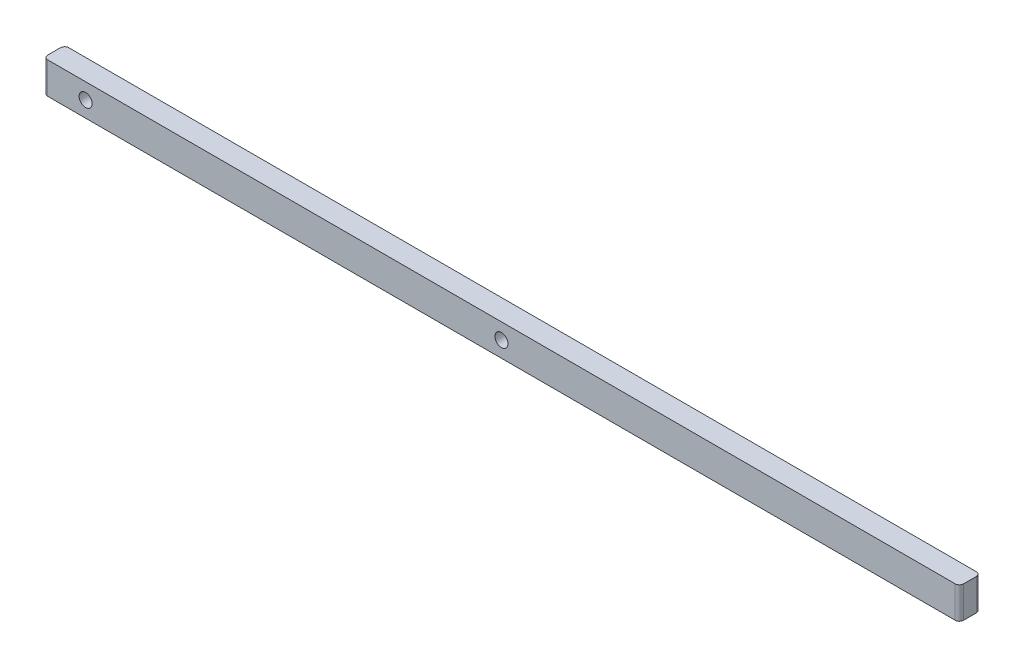
ISO-10303-21;
HEADER;
FILE_DESCRIPTION(('STEP AP214'),'2;1');
FILE_NAME('part.step','',(''),(''),'','','');
FILE_SCHEMA(('AUTOMOTIVE_DESIGN { 1 0 10303 214 1 1 1 1 }'));
ENDSEC;
DATA;
#1=APPLICATION_CONTEXT('core data for automotive mechanical design processes');
#2=APPLICATION_PROTOCOL_DEFINITION('international standard','automotive_design',2000,#1);
#3=PRODUCT_CONTEXT('',#1,'mechanical');
#4=PRODUCT('Part','Part','',(#3));
#5=PRODUCT_RELATED_PRODUCT_CATEGORY('part','',(#4));
#6=PRODUCT_DEFINITION_FORMATION('','',#4);
#7=PRODUCT_DEFINITION_CONTEXT('part definition',#1,'design');
#8=PRODUCT_DEFINITION('design','',#6,#7);
#9=PRODUCT_DEFINITION_SHAPE('','',#8);
#10=(LENGTH_UNIT() NAMED_UNIT(*) SI_UNIT(.MILLI.,.METRE.));
#11=(NAMED_UNIT(*) PLANE_ANGLE_UNIT() SI_UNIT($,.RADIAN.));
#12=(NAMED_UNIT(*) SI_UNIT($,.STERADIAN.) SOLID_ANGLE_UNIT());
#13=UNCERTAINTY_MEASURE_WITH_UNIT(LENGTH_MEASURE(1.E-05),#10,'distance_accuracy_value','');
#14=(GEOMETRIC_REPRESENTATION_CONTEXT(3) GLOBAL_UNCERTAINTY_ASSIGNED_CONTEXT((#13)) GLOBAL_UNIT_ASSIGNED_CONTEXT((#10,
#11,#12)) REPRESENTATION_CONTEXT('',''));
#15=CARTESIAN_POINT('',(0.,0.,0.));
#16=DIRECTION('',(0.,0.,1.));
#17=DIRECTION('',(1.,0.,0.));
#18=AXIS2_PLACEMENT_3D('',#15,#16,#17);
#19=CARTESIAN_POINT('',(276.225,-9.525,6.35));
#20=DIRECTION('',(-1.,0.,0.));
#21=DIRECTION('',(0.,0.,1.));
#22=AXIS2_PLACEMENT_3D('',#19,#20,#21);
#23=PLANE('',#22);
#24=DIRECTION('',(0.,0.,-1.));
#25=VECTOR('',#24,1.);
#26=CARTESIAN_POINT('',(276.225,-9.525,6.35));
#27=LINE('',#26,#25);
#28=CARTESIAN_POINT('',(276.225,-9.525,3.81));
#29=VERTEX_POINT('',#28);
#30=CARTESIAN_POINT('',(276.225,-9.525,-3.81));
#31=VERTEX_POINT('',#30);
#32=EDGE_CURVE('E130',#29,#31,#27,.T.);
#33=ORIENTED_EDGE('',*,*,#32,.T.);
#34=DIRECTION('',(0.,1.,0.));
#35=VECTOR('',#34,1.);
#36=CARTESIAN_POINT('',(276.225,9.525,-3.81));
#37=LINE('',#36,#35);
#38=CARTESIAN_POINT('',(276.225,9.525,-3.81));
#39=VERTEX_POINT('',#38);
#40=EDGE_CURVE('E11',#31,#39,#37,.T.);
#41=ORIENTED_EDGE('',*,*,#40,.T.);
#42=DIRECTION('',(0.,0.,-1.));
#43=VECTOR('',#42,1.);
#44=CARTESIAN_POINT('',(276.225,9.525,6.35));
#45=LINE('',#44,#43);
#46=CARTESIAN_POINT('',(276.225,9.525,3.81));
#47=VERTEX_POINT('',#46);
#48=EDGE_CURVE('E136',#47,#39,#45,.T.);
#49=ORIENTED_EDGE('',*,*,#48,.F.);
#50=DIRECTION('',(0.,1.,0.));
#51=VECTOR('',#50,1.);
#52=CARTESIAN_POINT('',(276.225,-9.525,3.81));
#53=LINE('',#52,#51);
#54=EDGE_CURVE('E48',#47,#29,#53,.F.);
#55=ORIENTED_EDGE('',*,*,#54,.T.);
#56=EDGE_LOOP('',(#33,#41,#49,#55));
#57=FACE_BOUND('',#56,.T.);
#58=ADVANCED_FACE('F39',(#57),#23,.F.);
#59=CARTESIAN_POINT('',(-276.225,9.525,6.35));
#60=DIRECTION('',(0.,-1.,0.));
#61=DIRECTION('',(0.,0.,-1.));
#62=AXIS2_PLACEMENT_3D('',#59,#60,#61);
#63=PLANE('',#62);
#64=DIRECTION('',(-1.,0.,0.));
#65=VECTOR('',#64,1.);
#66=CARTESIAN_POINT('',(-276.225,9.525,-6.35));
#67=LINE('',#66,#65);
#68=CARTESIAN_POINT('',(273.685,9.525,-6.35));
#69=VERTEX_POINT('',#68);
#70=CARTESIAN_POINT('',(-273.685,9.525,-6.35));
#71=VERTEX_POINT('',#70);
#72=EDGE_CURVE('E196',#69,#71,#67,.T.);
#73=ORIENTED_EDGE('',*,*,#72,.T.);
#74=CARTESIAN_POINT('',(-273.685,9.525,-3.81));
#75=DIRECTION('',(0.,-1.,0.));
#76=DIRECTION('',(0.,0.,-1.));
#77=AXIS2_PLACEMENT_3D('',#74,#75,#76);
#78=CIRCLE('',#77,2.54);
#79=CARTESIAN_POINT('',(-276.225,9.525,-3.81));
#80=VERTEX_POINT('',#79);
#81=EDGE_CURVE('E163',#71,#80,#78,.F.);
#82=ORIENTED_EDGE('',*,*,#81,.T.);
#83=DIRECTION('',(0.,0.,-1.));
#84=VECTOR('',#83,1.);
#85=CARTESIAN_POINT('',(-276.225,9.525,6.35));
#86=LINE('',#85,#84);
#87=CARTESIAN_POINT('',(-276.225,9.525,3.81));
#88=VERTEX_POINT('',#87);
#89=EDGE_CURVE('E129',#88,#80,#86,.T.);
#90=ORIENTED_EDGE('',*,*,#89,.F.);
#91=CARTESIAN_POINT('',(-273.685,9.525,3.81));
#92=DIRECTION('',(0.,-1.,0.));
#93=DIRECTION('',(0.,0.,-1.));
#94=AXIS2_PLACEMENT_3D('',#91,#92,#93);
#95=CIRCLE('',#94,2.54);
#96=CARTESIAN_POINT('',(-273.685,9.525,6.35));
#97=VERTEX_POINT('',#96);
#98=EDGE_CURVE('E134',#88,#97,#95,.F.);
#99=ORIENTED_EDGE('',*,*,#98,.T.);
#100=DIRECTION('',(-1.,0.,0.));
#101=VECTOR('',#100,1.);
#102=CARTESIAN_POINT('',(-276.225,9.525,6.35));
#103=LINE('',#102,#101);
#104=CARTESIAN_POINT('',(273.685,9.525,6.35));
#105=VERTEX_POINT('',#104);
#106=EDGE_CURVE('E187',#105,#97,#103,.T.);
#107=ORIENTED_EDGE('',*,*,#106,.F.);
#108=CARTESIAN_POINT('',(273.685,9.525,3.81));
#109=DIRECTION('',(0.,-1.,0.));
#110=DIRECTION('',(0.,0.,-1.));
#111=AXIS2_PLACEMENT_3D('',#108,#109,#110);
#112=CIRCLE('',#111,2.54);
#113=EDGE_CURVE('E62',#105,#47,#112,.F.);
#114=ORIENTED_EDGE('',*,*,#113,.T.);
#115=ORIENTED_EDGE('',*,*,#48,.T.);
#116=CARTESIAN_POINT('',(273.685,9.525,-3.81));
#117=DIRECTION('',(0.,-1.,0.));
#118=DIRECTION('',(0.,0.,-1.));
#119=AXIS2_PLACEMENT_3D('',#116,#117,#118);
#120=CIRCLE('',#119,2.54);
#121=EDGE_CURVE('E55',#39,#69,#120,.F.);
#122=ORIENTED_EDGE('',*,*,#121,.T.);
#123=EDGE_LOOP('',(#73,#82,#90,#99,#107,#114,#115,#122));
#124=FACE_BOUND('',#123,.T.);
#125=ADVANCED_FACE('F189',(#124),#63,.F.);
#126=CARTESIAN_POINT('',(-276.225,-9.525,6.35));
#127=DIRECTION('',(1.,0.,0.));
#128=DIRECTION('',(0.,0.,-1.));
#129=AXIS2_PLACEMENT_3D('',#126,#127,#128);
#130=PLANE('',#129);
#131=ORIENTED_EDGE('',*,*,#89,.T.);
#132=DIRECTION('',(0.,-1.,0.));
#133=VECTOR('',#132,1.);
#134=CARTESIAN_POINT('',(-276.225,-9.525,-3.81));
#135=LINE('',#134,#133);
#136=CARTESIAN_POINT('',(-276.225,-9.525,-3.81));
#137=VERTEX_POINT('',#136);
#138=EDGE_CURVE('E127',#80,#137,#135,.T.);
#139=ORIENTED_EDGE('',*,*,#138,.T.);
#140=DIRECTION('',(0.,0.,-1.));
#141=VECTOR('',#140,1.);
#142=CARTESIAN_POINT('',(-276.225,-9.525,6.35));
#143=LINE('',#142,#141);
#144=CARTESIAN_POINT('',(-276.225,-9.525,3.81));
#145=VERTEX_POINT('',#144);
#146=EDGE_CURVE('E109',#145,#137,#143,.T.);
#147=ORIENTED_EDGE('',*,*,#146,.F.);
#148=DIRECTION('',(0.,-1.,0.));
#149=VECTOR('',#148,1.);
#150=CARTESIAN_POINT('',(-276.225,-9.525,3.81));
#151=LINE('',#150,#149);
#152=EDGE_CURVE('E124',#145,#88,#151,.F.);
#153=ORIENTED_EDGE('',*,*,#152,.T.);
#154=EDGE_LOOP('',(#131,#139,#147,#153));
#155=FACE_BOUND('',#154,.T.);
#156=ADVANCED_FACE('F123',(#155),#130,.F.);
#157=CARTESIAN_POINT('',(-276.225,-9.525,6.35));
#158=DIRECTION('',(0.,1.,0.));
#159=DIRECTION('',(0.,0.,1.));
#160=AXIS2_PLACEMENT_3D('',#157,#158,#159);
#161=PLANE('',#160);
#162=ORIENTED_EDGE('',*,*,#146,.T.);
#163=CARTESIAN_POINT('',(-273.685,-9.525,-3.81));
#164=DIRECTION('',(0.,1.,0.));
#165=DIRECTION('',(0.,0.,1.));
#166=AXIS2_PLACEMENT_3D('',#163,#164,#165);
#167=CIRCLE('',#166,2.54);
#168=CARTESIAN_POINT('',(-273.685,-9.525,-6.35));
#169=VERTEX_POINT('',#168);
#170=EDGE_CURVE('E117',#137,#169,#167,.F.);
#171=ORIENTED_EDGE('',*,*,#170,.T.);
#172=DIRECTION('',(1.,0.,0.));
#173=VECTOR('',#172,1.);
#174=CARTESIAN_POINT('',(-276.225,-9.525,-6.35));
#175=LINE('',#174,#173);
#176=CARTESIAN_POINT('',(273.685,-9.525,-6.35));
#177=VERTEX_POINT('',#176);
#178=EDGE_CURVE('E191',#169,#177,#175,.T.);
#179=ORIENTED_EDGE('',*,*,#178,.T.);
#180=CARTESIAN_POINT('',(273.685,-9.525,-3.81));
#181=DIRECTION('',(0.,1.,0.));
#182=DIRECTION('',(0.,0.,1.));
#183=AXIS2_PLACEMENT_3D('',#180,#181,#182);
#184=CIRCLE('',#183,2.54);
#185=EDGE_CURVE('E118',#177,#31,#184,.F.);
#186=ORIENTED_EDGE('',*,*,#185,.T.);
#187=ORIENTED_EDGE('',*,*,#32,.F.);
#188=CARTESIAN_POINT('',(273.685,-9.525,3.81));
#189=DIRECTION('',(0.,1.,0.));
#190=DIRECTION('',(0.,0.,1.));
#191=AXIS2_PLACEMENT_3D('',#188,#189,#190);
#192=CIRCLE('',#191,2.54);
#193=CARTESIAN_POINT('',(273.685,-9.525,6.35));
#194=VERTEX_POINT('',#193);
#195=EDGE_CURVE('E140',#29,#194,#192,.F.);
#196=ORIENTED_EDGE('',*,*,#195,.T.);
#197=DIRECTION('',(1.,0.,0.));
#198=VECTOR('',#197,1.);
#199=CARTESIAN_POINT('',(-276.225,-9.525,6.35));
#200=LINE('',#199,#198);
#201=CARTESIAN_POINT('',(-273.685,-9.525,6.35));
#202=VERTEX_POINT('',#201);
#203=EDGE_CURVE('E111',#202,#194,#200,.T.);
#204=ORIENTED_EDGE('',*,*,#203,.F.);
#205=CARTESIAN_POINT('',(-273.685,-9.525,3.81));
#206=DIRECTION('',(0.,1.,0.));
#207=DIRECTION('',(0.,0.,1.));
#208=AXIS2_PLACEMENT_3D('',#205,#206,#207);
#209=CIRCLE('',#208,2.54);
#210=EDGE_CURVE('E106',#202,#145,#209,.F.);
#211=ORIENTED_EDGE('',*,*,#210,.T.);
#212=EDGE_LOOP('',(#162,#171,#179,#186,#187,#196,#204,#211));
#213=FACE_BOUND('',#212,.T.);
#214=ADVANCED_FACE('F108',(#213),#161,.F.);
#215=CARTESIAN_POINT('',(0.,0.,6.35));
#216=DIRECTION('',(0.,0.,-1.));
#217=DIRECTION('',(-1.,0.,0.));
#218=AXIS2_PLACEMENT_3D('',#215,#216,#217);
#219=PLANE('',#218);
#220=CARTESIAN_POINT('',(-250.825,0.,6.35));
#221=DIRECTION('',(0.,0.,-1.));
#222=DIRECTION('',(-1.,0.,0.));
#223=AXIS2_PLACEMENT_3D('',#220,#221,#222);
#224=CIRCLE('',#223,3.937);
#225=CARTESIAN_POINT('',(-254.762,0.,6.35));
#226=VERTEX_POINT('',#225);
#227=EDGE_CURVE('E199',#226,#226,#224,.T.);
#228=ORIENTED_EDGE('',*,*,#227,.T.);
#229=EDGE_LOOP('',(#228));
#230=FACE_BOUND('',#229,.T.);
#231=CARTESIAN_POINT('',(0.,0.,6.35));
#232=DIRECTION('',(0.,0.,-1.));
#233=DIRECTION('',(-1.,0.,0.));
#234=AXIS2_PLACEMENT_3D('',#231,#232,#233);
#235=CIRCLE('',#234,3.937);
#236=CARTESIAN_POINT('',(-3.937,0.,6.35));
#237=VERTEX_POINT('',#236);
#238=EDGE_CURVE('E324',#237,#237,#235,.T.);
#239=ORIENTED_EDGE('',*,*,#238,.T.);
#240=EDGE_LOOP('',(#239));
#241=FACE_BOUND('',#240,.T.);
#242=ORIENTED_EDGE('',*,*,#106,.T.);
#243=DIRECTION('',(0.,-1.,0.));
#244=VECTOR('',#243,1.);
#245=CARTESIAN_POINT('',(-273.685,0.,6.35));
#246=LINE('',#245,#244);
#247=EDGE_CURVE('E170',#97,#202,#246,.T.);
#248=ORIENTED_EDGE('',*,*,#247,.T.);
#249=ORIENTED_EDGE('',*,*,#203,.T.);
#250=DIRECTION('',(0.,1.,0.));
#251=VECTOR('',#250,1.);
#252=CARTESIAN_POINT('',(273.685,0.,6.35));
#253=LINE('',#252,#251);
#254=EDGE_CURVE('E166',#194,#105,#253,.T.);
#255=ORIENTED_EDGE('',*,*,#254,.T.);
#256=EDGE_LOOP('',(#242,#248,#249,#255));
#257=FACE_BOUND('',#256,.T.);
#258=ADVANCED_FACE('F186',(#230,#241,#257),#219,.F.);
#259=CARTESIAN_POINT('',(0.,0.,-6.35));
#260=DIRECTION('',(0.,0.,-1.));
#261=DIRECTION('',(-1.,0.,0.));
#262=AXIS2_PLACEMENT_3D('',#259,#260,#261);
#263=PLANE('',#262);
#264=CARTESIAN_POINT('',(-250.825,0.,-6.35));
#265=DIRECTION('',(0.,0.,1.));
#266=DIRECTION('',(1.,0.,0.));
#267=AXIS2_PLACEMENT_3D('',#264,#265,#266);
#268=CIRCLE('',#267,3.937);
#269=CARTESIAN_POINT('',(-246.888,0.,-6.35));
#270=VERTEX_POINT('',#269);
#271=EDGE_CURVE('E317',#270,#270,#268,.T.);
#272=ORIENTED_EDGE('',*,*,#271,.T.);
#273=EDGE_LOOP('',(#272));
#274=FACE_BOUND('',#273,.T.);
#275=CARTESIAN_POINT('',(0.,0.,-6.35));
#276=DIRECTION('',(0.,0.,1.));
#277=DIRECTION('',(1.,0.,0.));
#278=AXIS2_PLACEMENT_3D('',#275,#276,#277);
#279=CIRCLE('',#278,3.937);
#280=CARTESIAN_POINT('',(3.937,0.,-6.35));
#281=VERTEX_POINT('',#280);
#282=EDGE_CURVE('E320',#281,#281,#279,.T.);
#283=ORIENTED_EDGE('',*,*,#282,.T.);
#284=EDGE_LOOP('',(#283));
#285=FACE_BOUND('',#284,.T.);
#286=ORIENTED_EDGE('',*,*,#178,.F.);
#287=DIRECTION('',(0.,-1.,0.));
#288=VECTOR('',#287,1.);
#289=CARTESIAN_POINT('',(-273.685,9.525,-6.35));
#290=LINE('',#289,#288);
#291=EDGE_CURVE('E154',#169,#71,#290,.F.);
#292=ORIENTED_EDGE('',*,*,#291,.T.);
#293=ORIENTED_EDGE('',*,*,#72,.F.);
#294=DIRECTION('',(0.,1.,0.));
#295=VECTOR('',#294,1.);
#296=CARTESIAN_POINT('',(273.685,-9.525,-6.35));
#297=LINE('',#296,#295);
#298=EDGE_CURVE('E151',#69,#177,#297,.F.);
#299=ORIENTED_EDGE('',*,*,#298,.T.);
#300=EDGE_LOOP('',(#286,#292,#293,#299));
#301=FACE_BOUND('',#300,.T.);
#302=ADVANCED_FACE('F210',(#274,#285,#301),#263,.T.);
#303=CARTESIAN_POINT('',(0.,0.,-6.35));
#304=DIRECTION('',(0.,0.,1.));
#305=DIRECTION('',(1.,0.,0.));
#306=AXIS2_PLACEMENT_3D('',#303,#304,#305);
#307=CYLINDRICAL_SURFACE('',#306,3.937);
#308=ORIENTED_EDGE('',*,*,#282,.F.);
#309=EDGE_LOOP('',(#308));
#310=FACE_BOUND('',#309,.T.);
#311=ORIENTED_EDGE('',*,*,#238,.F.);
#312=EDGE_LOOP('',(#311));
#313=FACE_BOUND('',#312,.T.);
#314=ADVANCED_FACE('F232',(#310,#313),#307,.F.);
#315=CARTESIAN_POINT('',(-250.825,0.,-6.35));
#316=DIRECTION('',(0.,0.,1.));
#317=DIRECTION('',(1.,0.,0.));
#318=AXIS2_PLACEMENT_3D('',#315,#316,#317);
#319=CYLINDRICAL_SURFACE('',#318,3.937);
#320=ORIENTED_EDGE('',*,*,#271,.F.);
#321=EDGE_LOOP('',(#320));
#322=FACE_BOUND('',#321,.T.);
#323=ORIENTED_EDGE('',*,*,#227,.F.);
#324=EDGE_LOOP('',(#323));
#325=FACE_BOUND('',#324,.T.);
#326=ADVANCED_FACE('F228',(#322,#325),#319,.F.);
#327=CARTESIAN_POINT('',(-273.685,-9.525,-3.81));
#328=DIRECTION('',(0.,1.,0.));
#329=DIRECTION('',(0.,0.,1.));
#330=AXIS2_PLACEMENT_3D('',#327,#328,#329);
#331=CYLINDRICAL_SURFACE('',#330,2.54);
#332=ORIENTED_EDGE('',*,*,#81,.F.);
#333=ORIENTED_EDGE('',*,*,#291,.F.);
#334=ORIENTED_EDGE('',*,*,#170,.F.);
#335=ORIENTED_EDGE('',*,*,#138,.F.);
#336=EDGE_LOOP('',(#332,#333,#334,#335));
#337=FACE_BOUND('',#336,.T.);
#338=ADVANCED_FACE('F206',(#337),#331,.T.);
#339=CARTESIAN_POINT('',(-273.685,0.,3.81));
#340=DIRECTION('',(0.,-1.,0.));
#341=DIRECTION('',(0.,0.,-1.));
#342=AXIS2_PLACEMENT_3D('',#339,#340,#341);
#343=CYLINDRICAL_SURFACE('',#342,2.54);
#344=ORIENTED_EDGE('',*,*,#98,.F.);
#345=ORIENTED_EDGE('',*,*,#152,.F.);
#346=ORIENTED_EDGE('',*,*,#210,.F.);
#347=ORIENTED_EDGE('',*,*,#247,.F.);
#348=EDGE_LOOP('',(#344,#345,#346,#347));
#349=FACE_BOUND('',#348,.T.);
#350=ADVANCED_FACE('F133',(#349),#343,.T.);
#351=CARTESIAN_POINT('',(273.685,-9.525,-3.81));
#352=DIRECTION('',(0.,-1.,0.));
#353=DIRECTION('',(0.,0.,-1.));
#354=AXIS2_PLACEMENT_3D('',#351,#352,#353);
#355=CYLINDRICAL_SURFACE('',#354,2.54);
#356=ORIENTED_EDGE('',*,*,#185,.F.);
#357=ORIENTED_EDGE('',*,*,#298,.F.);
#358=ORIENTED_EDGE('',*,*,#121,.F.);
#359=ORIENTED_EDGE('',*,*,#40,.F.);
#360=EDGE_LOOP('',(#356,#357,#358,#359));
#361=FACE_BOUND('',#360,.T.);
#362=ADVANCED_FACE('F212',(#361),#355,.T.);
#363=CARTESIAN_POINT('',(273.685,0.,3.81));
#364=DIRECTION('',(0.,1.,0.));
#365=DIRECTION('',(0.,0.,1.));
#366=AXIS2_PLACEMENT_3D('',#363,#364,#365);
#367=CYLINDRICAL_SURFACE('',#366,2.54);
#368=ORIENTED_EDGE('',*,*,#195,.F.);
#369=ORIENTED_EDGE('',*,*,#54,.F.);
#370=ORIENTED_EDGE('',*,*,#113,.F.);
#371=ORIENTED_EDGE('',*,*,#254,.F.);
#372=EDGE_LOOP('',(#368,#369,#370,#371));
#373=FACE_BOUND('',#372,.T.);
#374=ADVANCED_FACE('F41',(#373),#367,.T.);
#375=CLOSED_SHELL('',(#58,#125,#156,#214,#258,#302,#314,#326,#338,#350,#362,#374));
#376=MANIFOLD_SOLID_BREP('B2',#375);
#377=ADVANCED_BREP_SHAPE_REPRESENTATION('',(#18,#376),#14);
#378=SHAPE_DEFINITION_REPRESENTATION(#9,#377);
ENDSEC;
END-ISO-10303-21;
